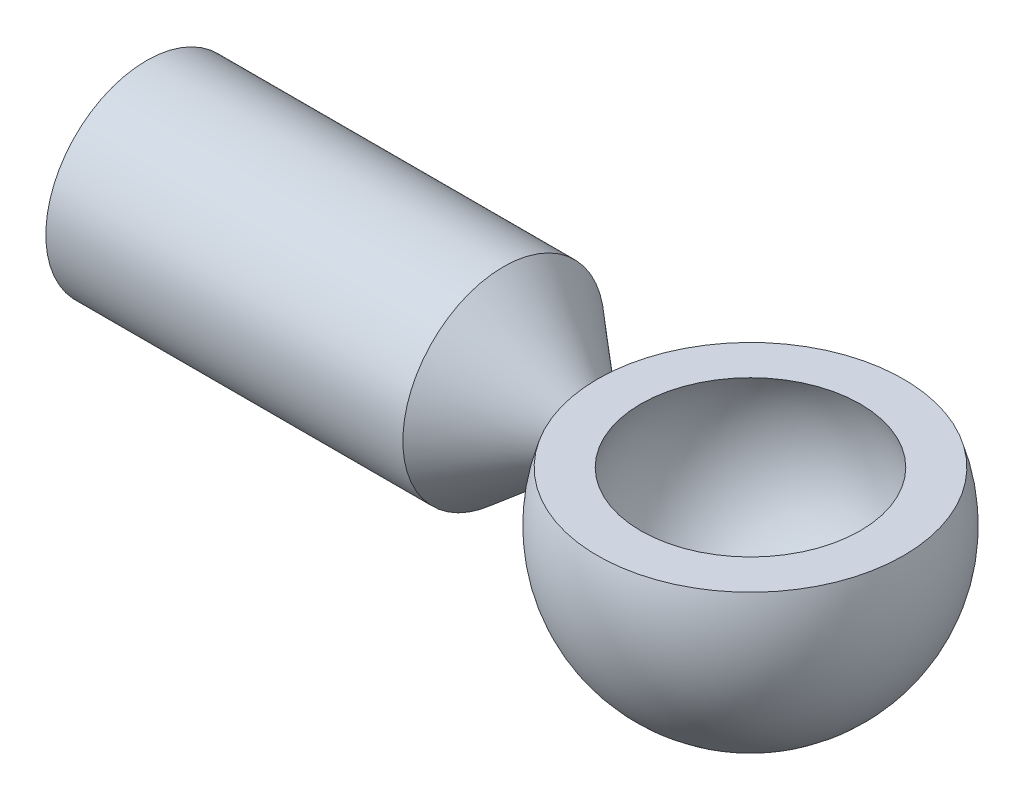
ISO-10303-21;
HEADER;
FILE_DESCRIPTION(('STEP AP214'),'2;1');
FILE_NAME('part.step','',(''),(''),'','','');
FILE_SCHEMA(('AUTOMOTIVE_DESIGN { 1 0 10303 214 1 1 1 1 }'));
ENDSEC;
DATA;
#1=APPLICATION_CONTEXT('core data for automotive mechanical design processes');
#2=APPLICATION_PROTOCOL_DEFINITION('international standard','automotive_design',2000,#1);
#3=PRODUCT_CONTEXT('',#1,'mechanical');
#4=PRODUCT('Part','Part','',(#3));
#5=PRODUCT_RELATED_PRODUCT_CATEGORY('part','',(#4));
#6=PRODUCT_DEFINITION_FORMATION('','',#4);
#7=PRODUCT_DEFINITION_CONTEXT('part definition',#1,'design');
#8=PRODUCT_DEFINITION('design','',#6,#7);
#9=PRODUCT_DEFINITION_SHAPE('','',#8);
#10=(LENGTH_UNIT() NAMED_UNIT(*) SI_UNIT(.MILLI.,.METRE.));
#11=(NAMED_UNIT(*) PLANE_ANGLE_UNIT() SI_UNIT($,.RADIAN.));
#12=(NAMED_UNIT(*) SI_UNIT($,.STERADIAN.) SOLID_ANGLE_UNIT());
#13=UNCERTAINTY_MEASURE_WITH_UNIT(LENGTH_MEASURE(1.E-05),#10,'distance_accuracy_value','');
#14=(GEOMETRIC_REPRESENTATION_CONTEXT(3) GLOBAL_UNCERTAINTY_ASSIGNED_CONTEXT((#13)) GLOBAL_UNIT_ASSIGNED_CONTEXT((#10,
#11,#12)) REPRESENTATION_CONTEXT('',''));
#15=CARTESIAN_POINT('',(0.,0.,0.));
#16=DIRECTION('',(0.,0.,1.));
#17=DIRECTION('',(1.,0.,0.));
#18=AXIS2_PLACEMENT_3D('',#15,#16,#17);
#19=CARTESIAN_POINT('',(0.,0.,0.));
#20=DIRECTION('',(0.,1.,0.));
#21=DIRECTION('',(-1.,0.,0.));
#22=AXIS2_PLACEMENT_3D('',#19,#20,#21);
#23=SPHERICAL_SURFACE('',#22,6.);
#24=CARTESIAN_POINT('',(0.,2.50000000000006,0.));
#25=DIRECTION('',(0.,1.,0.));
#26=DIRECTION('',(-1.,0.,0.));
#27=AXIS2_PLACEMENT_3D('',#24,#25,#26);
#28=CIRCLE('',#27,5.45435605731783);
#29=CARTESIAN_POINT('',(-5.45435605731786,2.5,0.));
#30=VERTEX_POINT('',#29);
#31=EDGE_CURVE('E39',#30,#30,#28,.T.);
#32=ORIENTED_EDGE('',*,*,#31,.T.);
#33=EDGE_LOOP('',(#32));
#34=FACE_BOUND('',#33,.T.);
#35=ADVANCED_FACE('F33',(#34),#23,.F.);
#36=CARTESIAN_POINT('',(-5.45435605731786,2.50000000000001,0.));
#37=DIRECTION('',(0.,1.,0.));
#38=DIRECTION('',(-1.,0.,0.));
#39=AXIS2_PLACEMENT_3D('',#36,#37,#38);
#40=PLANE('',#39);
#41=CARTESIAN_POINT('',(0.,2.50000000000008,0.));
#42=DIRECTION('',(0.,1.,0.));
#43=DIRECTION('',(-1.,0.,0.));
#44=AXIS2_PLACEMENT_3D('',#41,#42,#43);
#45=CIRCLE('',#44,7.59934207678531);
#46=CARTESIAN_POINT('',(-7.59934207678533,2.5,0.));
#47=VERTEX_POINT('',#46);
#48=EDGE_CURVE('E43',#47,#47,#45,.T.);
#49=ORIENTED_EDGE('',*,*,#48,.T.);
#50=EDGE_LOOP('',(#49));
#51=FACE_BOUND('',#50,.T.);
#52=ORIENTED_EDGE('',*,*,#31,.F.);
#53=EDGE_LOOP('',(#52));
#54=FACE_BOUND('',#53,.T.);
#55=ADVANCED_FACE('F89',(#51,#54),#40,.T.);
#56=CARTESIAN_POINT('',(0.,0.,0.));
#57=DIRECTION('',(0.,1.,0.));
#58=DIRECTION('',(-1.,0.,0.));
#59=AXIS2_PLACEMENT_3D('',#56,#57,#58);
#60=SPHERICAL_SURFACE('',#59,8.);
#61=CARTESIAN_POINT('',(-7.88923972809813,0.,0.));
#62=DIRECTION('',(1.,0.,0.));
#63=DIRECTION('',(0.,1.,0.));
#64=AXIS2_PLACEMENT_3D('',#61,#62,#63);
#65=CIRCLE('',#64,1.32661091228669);
#66=CARTESIAN_POINT('',(-7.88923972809813,-1.32661091228669,0.));
#67=VERTEX_POINT('',#66);
#68=EDGE_CURVE('E10',#67,#67,#65,.F.);
#69=ORIENTED_EDGE('',*,*,#68,.F.);
#70=EDGE_LOOP('',(#69));
#71=FACE_BOUND('',#70,.T.);
#72=ORIENTED_EDGE('',*,*,#48,.F.);
#73=EDGE_LOOP('',(#72));
#74=FACE_BOUND('',#73,.T.);
#75=ADVANCED_FACE('F84',(#71,#74),#60,.T.);
#76=CARTESIAN_POINT('',(-7.5,0.,0.));
#77=DIRECTION('',(-1.,0.,0.));
#78=DIRECTION('',(0.,-1.,0.));
#79=AXIS2_PLACEMENT_3D('',#76,#77,#78);
#80=CONICAL_SURFACE('',#79,1.,0.698131700797733);
#81=CARTESIAN_POINT('',(-12.2670143703768,0.,0.));
#82=DIRECTION('',(1.,0.,0.));
#83=DIRECTION('',(0.,1.,0.));
#84=AXIS2_PLACEMENT_3D('',#81,#82,#83);
#85=CIRCLE('',#84,5.);
#86=CARTESIAN_POINT('',(-12.2670143703768,-5.,0.));
#87=VERTEX_POINT('',#86);
#88=EDGE_CURVE('E47',#87,#87,#85,.T.);
#89=CARTESIAN_POINT('',(-7.88923972809813,-1.32661091228669,0.));
#90=CARTESIAN_POINT('',(-7.93484154728853,-1.36487538195037,0.));
#91=CARTESIAN_POINT('',(-7.98044336647894,-1.40313985161405,0.));
#92=CARTESIAN_POINT('',(-8.07164700485974,-1.47966879094141,0.));
#93=CARTESIAN_POINT('',(-8.11724882405015,-1.51793326060509,0.));
#94=CARTESIAN_POINT('',(-8.20845246243095,-1.59446219993245,0.));
#95=CARTESIAN_POINT('',(-8.25405428162136,-1.63272666959613,0.));
#96=CARTESIAN_POINT('',(-8.34525792000216,-1.70925560892349,0.));
#97=CARTESIAN_POINT('',(-8.39085973919256,-1.74752007858717,0.));
#98=CARTESIAN_POINT('',(-8.48206337757337,-1.82404901791453,0.));
#99=CARTESIAN_POINT('',(-8.52766519676377,-1.86231348757821,0.));
#100=CARTESIAN_POINT('',(-8.61886883514458,-1.93884242690557,0.));
#101=CARTESIAN_POINT('',(-8.66447065433498,-1.97710689656925,0.));
#102=CARTESIAN_POINT('',(-8.75567429271579,-2.05363583589662,0.));
#103=CARTESIAN_POINT('',(-8.80127611190619,-2.0919003055603,0.));
#104=CARTESIAN_POINT('',(-8.892479750287,-2.16842924488766,0.));
#105=CARTESIAN_POINT('',(-8.9380815694774,-2.20669371455134,0.));
#106=CARTESIAN_POINT('',(-9.02928520785821,-2.2832226538787,0.));
#107=CARTESIAN_POINT('',(-9.07488702704861,-2.32148712354238,0.));
#108=CARTESIAN_POINT('',(-9.16609066542942,-2.39801606286974,0.));
#109=CARTESIAN_POINT('',(-9.21169248461982,-2.43628053253342,0.));
#110=CARTESIAN_POINT('',(-9.30289612300063,-2.51280947186078,0.));
#111=CARTESIAN_POINT('',(-9.34849794219103,-2.55107394152446,0.));
#112=CARTESIAN_POINT('',(-9.43970158057183,-2.62760288085182,0.));
#113=CARTESIAN_POINT('',(-9.48530339976224,-2.6658673505155,0.));
#114=CARTESIAN_POINT('',(-9.57650703814304,-2.74239628984286,0.));
#115=CARTESIAN_POINT('',(-9.62210885733345,-2.78066075950654,0.));
#116=CARTESIAN_POINT('',(-9.71331249571425,-2.8571896988339,0.));
#117=CARTESIAN_POINT('',(-9.75891431490465,-2.89545416849758,0.));
#118=CARTESIAN_POINT('',(-9.85011795328546,-2.97198310782494,0.));
#119=CARTESIAN_POINT('',(-9.89571977247586,-3.01024757748862,0.));
#120=CARTESIAN_POINT('',(-9.98692341085667,-3.08677651681598,0.));
#121=CARTESIAN_POINT('',(-10.0325252300471,-3.12504098647966,0.));
#122=CARTESIAN_POINT('',(-10.1237288684279,-3.20156992580702,0.));
#123=CARTESIAN_POINT('',(-10.1693306876183,-3.23983439547071,0.));
#124=CARTESIAN_POINT('',(-10.2605343259991,-3.31636333479807,0.));
#125=CARTESIAN_POINT('',(-10.3061361451895,-3.35462780446175,0.));
#126=CARTESIAN_POINT('',(-10.3973397835703,-3.43115674378911,0.));
#127=CARTESIAN_POINT('',(-10.4429416027607,-3.46942121345279,0.));
#128=CARTESIAN_POINT('',(-10.5341452411415,-3.54595015278015,0.));
#129=CARTESIAN_POINT('',(-10.5797470603319,-3.58421462244383,0.));
#130=CARTESIAN_POINT('',(-10.6709506987127,-3.66074356177119,0.));
#131=CARTESIAN_POINT('',(-10.7165525179031,-3.69900803143487,0.));
#132=CARTESIAN_POINT('',(-10.8077561562839,-3.77553697076223,0.));
#133=CARTESIAN_POINT('',(-10.8533579754743,-3.81380144042591,0.));
#134=CARTESIAN_POINT('',(-10.9445616138551,-3.89033037975327,0.));
#135=CARTESIAN_POINT('',(-10.9901634330455,-3.92859484941695,0.));
#136=CARTESIAN_POINT('',(-11.0813670714263,-4.00512378874431,0.));
#137=CARTESIAN_POINT('',(-11.1269688906167,-4.04338825840799,0.));
#138=CARTESIAN_POINT('',(-11.2181725289976,-4.11991719773535,0.));
#139=CARTESIAN_POINT('',(-11.263774348188,-4.15818166739903,0.));
#140=CARTESIAN_POINT('',(-11.3549779865688,-4.23471060672639,0.));
#141=CARTESIAN_POINT('',(-11.4005798057592,-4.27297507639007,0.));
#142=CARTESIAN_POINT('',(-11.49178344414,-4.34950401571743,0.));
#143=CARTESIAN_POINT('',(-11.5373852633304,-4.38776848538112,0.));
#144=CARTESIAN_POINT('',(-11.6285889017112,-4.46429742470847,0.));
#145=CARTESIAN_POINT('',(-11.6741907209016,-4.50256189437216,0.));
#146=CARTESIAN_POINT('',(-11.7653943592824,-4.57909083369952,0.));
#147=CARTESIAN_POINT('',(-11.8109961784728,-4.6173553033632,0.));
#148=CARTESIAN_POINT('',(-11.9021998168536,-4.69388424269056,0.));
#149=CARTESIAN_POINT('',(-11.947801636044,-4.73214871235424,0.));
#150=CARTESIAN_POINT('',(-12.0390052744248,-4.8086776516816,0.));
#151=CARTESIAN_POINT('',(-12.0846070936152,-4.84694212134528,0.));
#152=CARTESIAN_POINT('',(-12.175810731996,-4.92347106067264,0.));
#153=CARTESIAN_POINT('',(-12.2214125511864,-4.96173553033632,0.));
#154=CARTESIAN_POINT('',(-12.2670143703768,-5.,0.));
#155=B_SPLINE_CURVE_WITH_KNOTS('',3,(#89,#90,#91,#92,#93,#94,#95,#96,#97,#98,#99,#100,#101,#102,
#103,#104,#105,#106,#107,#108,#109,#110,#111,#112,#113,#114,#115,#116,#117,#118,#119,#120,#121,
#122,#123,#124,#125,#126,#127,#128,#129,#130,#131,#132,#133,#134,#135,#136,#137,#138,#139,#140,
#141,#142,#143,#144,#145,#146,#147,#148,#149,#150,#151,#152,#153,#154),.UNSPECIFIED.,.F.,.F.,(4,
2,2,2,2,2,2,2,2,2,2,2,2,2,2,2,2,2,2,2,2,2,2,2,2,2,2,2,2,2,2,2,4),(0.,0.178586841533895,
0.357173683067789,0.535760524601683,0.714347366135579,0.892934207669473,1.07152104920337,
1.25010789073726,1.42869473227116,1.60728157380505,1.78586841533894,1.96445525687284,
2.14304209840673,2.32162893994063,2.50021578147452,2.67880262300842,2.85738946454231,
3.0359763060762,3.2145631476101,3.39314998914399,3.57173683067789,3.75032367221178,
3.92891051374568,4.10749735527957,4.28608419681346,4.46467103834736,4.64325787988125,
4.82184472141515,5.00043156294904,5.17901840448294,5.35760524601683,5.53619208755073,
5.71477892908462),.UNSPECIFIED.);
#156=EDGE_CURVE('BSEAM79',#67,#87,#155,.T.);
#157=ORIENTED_EDGE('',*,*,#68,.T.);
#158=ORIENTED_EDGE('',*,*,#88,.T.);
#159=ORIENTED_EDGE('',*,*,#156,.T.);
#160=ORIENTED_EDGE('',*,*,#156,.F.);
#161=EDGE_LOOP('',(#157,#159,#158,#160));
#162=FACE_BOUND('',#161,.T.);
#163=ADVANCED_FACE('F79',(#162),#80,.T.);
#164=CARTESIAN_POINT('',(-7.5,0.,0.));
#165=DIRECTION('',(1.,0.,0.));
#166=DIRECTION('',(0.,1.,0.));
#167=AXIS2_PLACEMENT_3D('',#164,#165,#166);
#168=CYLINDRICAL_SURFACE('',#167,5.);
#169=CARTESIAN_POINT('',(-30.,0.,0.));
#170=DIRECTION('',(1.,0.,0.));
#171=DIRECTION('',(0.,1.,0.));
#172=AXIS2_PLACEMENT_3D('',#169,#170,#171);
#173=CIRCLE('',#172,5.);
#174=CARTESIAN_POINT('',(-30.,5.,0.));
#175=VERTEX_POINT('',#174);
#176=EDGE_CURVE('E52',#175,#175,#173,.T.);
#177=ORIENTED_EDGE('',*,*,#176,.T.);
#178=EDGE_LOOP('',(#177));
#179=FACE_BOUND('',#178,.T.);
#180=ORIENTED_EDGE('',*,*,#88,.F.);
#181=EDGE_LOOP('',(#180));
#182=FACE_BOUND('',#181,.T.);
#183=ADVANCED_FACE('F73',(#179,#182),#168,.T.);
#184=CARTESIAN_POINT('',(-30.,5.,0.));
#185=DIRECTION('',(-1.,0.,0.));
#186=DIRECTION('',(0.,-1.,0.));
#187=AXIS2_PLACEMENT_3D('',#184,#185,#186);
#188=PLANE('',#187);
#189=CARTESIAN_POINT('',(-30.,0.,0.));
#190=DIRECTION('',(-1.,0.,0.));
#191=DIRECTION('',(0.,-1.,0.));
#192=AXIS2_PLACEMENT_3D('',#189,#190,#191);
#193=CIRCLE('',#192,3.);
#194=CARTESIAN_POINT('',(-30.,-3.,0.));
#195=VERTEX_POINT('',#194);
#196=EDGE_CURVE('E56',#195,#195,#193,.T.);
#197=ORIENTED_EDGE('',*,*,#196,.F.);
#198=EDGE_LOOP('',(#197));
#199=FACE_BOUND('',#198,.T.);
#200=ORIENTED_EDGE('',*,*,#176,.F.);
#201=EDGE_LOOP('',(#200));
#202=FACE_BOUND('',#201,.T.);
#203=ADVANCED_FACE('F67',(#199,#202),#188,.T.);
#204=CARTESIAN_POINT('',(-15.,0.,0.));
#205=DIRECTION('',(-1.,0.,0.));
#206=DIRECTION('',(0.,-1.,0.));
#207=AXIS2_PLACEMENT_3D('',#204,#205,#206);
#208=CYLINDRICAL_SURFACE('',#207,3.);
#209=CARTESIAN_POINT('',(-15.,0.,0.));
#210=DIRECTION('',(-1.,0.,0.));
#211=DIRECTION('',(0.,-1.,0.));
#212=AXIS2_PLACEMENT_3D('',#209,#210,#211);
#213=CIRCLE('',#212,3.);
#214=CARTESIAN_POINT('',(-15.,-3.,0.));
#215=VERTEX_POINT('',#214);
#216=EDGE_CURVE('E55',#215,#215,#213,.T.);
#217=ORIENTED_EDGE('',*,*,#216,.F.);
#218=EDGE_LOOP('',(#217));
#219=FACE_BOUND('',#218,.T.);
#220=ORIENTED_EDGE('',*,*,#196,.T.);
#221=EDGE_LOOP('',(#220));
#222=FACE_BOUND('',#221,.T.);
#223=ADVANCED_FACE('F64',(#219,#222),#208,.F.);
#224=CARTESIAN_POINT('',(-15.,0.,0.));
#225=DIRECTION('',(-1.,0.,0.));
#226=DIRECTION('',(0.,-1.,0.));
#227=AXIS2_PLACEMENT_3D('',#224,#225,#226);
#228=PLANE('',#227);
#229=ORIENTED_EDGE('',*,*,#216,.T.);
#230=EDGE_LOOP('',(#229));
#231=FACE_BOUND('',#230,.T.);
#232=ADVANCED_FACE('F62',(#231),#228,.T.);
#233=CLOSED_SHELL('',(#35,#55,#75,#163,#183,#203,#223,#232));
#234=MANIFOLD_SOLID_BREP('B2',#233);
#235=ADVANCED_BREP_SHAPE_REPRESENTATION('',(#18,#234),#14);
#236=SHAPE_DEFINITION_REPRESENTATION(#9,#235);
ENDSEC;
END-ISO-10303-21;
